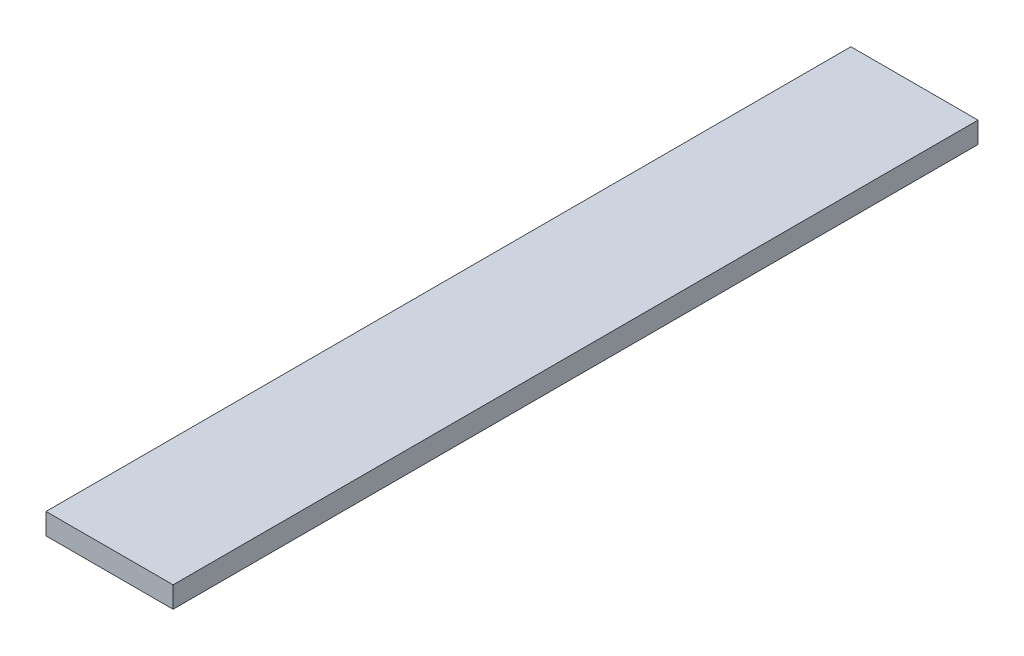
ISO-10303-21;
HEADER;
FILE_DESCRIPTION(('STEP AP214'),'2;1');
FILE_NAME('part.step','',(''),(''),'','','');
FILE_SCHEMA(('AUTOMOTIVE_DESIGN { 1 0 10303 214 1 1 1 1 }'));
ENDSEC;
DATA;
#1=APPLICATION_CONTEXT('core data for automotive mechanical design processes');
#2=APPLICATION_PROTOCOL_DEFINITION('international standard','automotive_design',2000,#1);
#3=PRODUCT_CONTEXT('',#1,'mechanical');
#4=PRODUCT('Part','Part','',(#3));
#5=PRODUCT_RELATED_PRODUCT_CATEGORY('part','',(#4));
#6=PRODUCT_DEFINITION_FORMATION('','',#4);
#7=PRODUCT_DEFINITION_CONTEXT('part definition',#1,'design');
#8=PRODUCT_DEFINITION('design','',#6,#7);
#9=PRODUCT_DEFINITION_SHAPE('','',#8);
#10=(LENGTH_UNIT() NAMED_UNIT(*) SI_UNIT(.MILLI.,.METRE.));
#11=(NAMED_UNIT(*) PLANE_ANGLE_UNIT() SI_UNIT($,.RADIAN.));
#12=(NAMED_UNIT(*) SI_UNIT($,.STERADIAN.) SOLID_ANGLE_UNIT());
#13=UNCERTAINTY_MEASURE_WITH_UNIT(LENGTH_MEASURE(1.E-05),#10,'distance_accuracy_value','');
#14=(GEOMETRIC_REPRESENTATION_CONTEXT(3) GLOBAL_UNCERTAINTY_ASSIGNED_CONTEXT((#13)) GLOBAL_UNIT_ASSIGNED_CONTEXT((#10,
#11,#12)) REPRESENTATION_CONTEXT('',''));
#15=CARTESIAN_POINT('',(0.,0.,0.));
#16=DIRECTION('',(0.,0.,1.));
#17=DIRECTION('',(1.,0.,0.));
#18=AXIS2_PLACEMENT_3D('',#15,#16,#17);
#19=CARTESIAN_POINT('',(19.05,3.175,241.3));
#20=DIRECTION('',(-1.,0.,0.));
#21=DIRECTION('',(0.,0.,1.));
#22=AXIS2_PLACEMENT_3D('',#19,#20,#21);
#23=PLANE('',#22);
#24=DIRECTION('',(0.,1.,0.));
#25=VECTOR('',#24,1.);
#26=CARTESIAN_POINT('',(19.05,3.175,0.));
#27=LINE('',#26,#25);
#28=CARTESIAN_POINT('',(19.05,-3.175,0.));
#29=VERTEX_POINT('',#28);
#30=CARTESIAN_POINT('',(19.05,3.175,0.));
#31=VERTEX_POINT('',#30);
#32=EDGE_CURVE('E100',#29,#31,#27,.T.);
#33=ORIENTED_EDGE('',*,*,#32,.T.);
#34=DIRECTION('',(0.,0.,-1.));
#35=VECTOR('',#34,1.);
#36=CARTESIAN_POINT('',(19.05,3.175,241.3));
#37=LINE('',#36,#35);
#38=CARTESIAN_POINT('',(19.05,3.175,241.3));
#39=VERTEX_POINT('',#38);
#40=EDGE_CURVE('E11',#39,#31,#37,.T.);
#41=ORIENTED_EDGE('',*,*,#40,.F.);
#42=DIRECTION('',(0.,1.,0.));
#43=VECTOR('',#42,1.);
#44=CARTESIAN_POINT('',(19.05,3.175,241.3));
#45=LINE('',#44,#43);
#46=CARTESIAN_POINT('',(19.05,-3.175,241.3));
#47=VERTEX_POINT('',#46);
#48=EDGE_CURVE('E88',#47,#39,#45,.T.);
#49=ORIENTED_EDGE('',*,*,#48,.F.);
#50=DIRECTION('',(0.,0.,-1.));
#51=VECTOR('',#50,1.);
#52=CARTESIAN_POINT('',(19.05,-3.175,241.3));
#53=LINE('',#52,#51);
#54=EDGE_CURVE('E96',#47,#29,#53,.T.);
#55=ORIENTED_EDGE('',*,*,#54,.T.);
#56=EDGE_LOOP('',(#33,#41,#49,#55));
#57=FACE_BOUND('',#56,.T.);
#58=ADVANCED_FACE('F37',(#57),#23,.F.);
#59=CARTESIAN_POINT('',(-19.05,3.175,241.3));
#60=DIRECTION('',(0.,-1.,0.));
#61=DIRECTION('',(0.,0.,-1.));
#62=AXIS2_PLACEMENT_3D('',#59,#60,#61);
#63=PLANE('',#62);
#64=DIRECTION('',(-1.,0.,0.));
#65=VECTOR('',#64,1.);
#66=CARTESIAN_POINT('',(-19.05,3.175,0.));
#67=LINE('',#66,#65);
#68=CARTESIAN_POINT('',(-19.05,3.175,0.));
#69=VERTEX_POINT('',#68);
#70=EDGE_CURVE('E92',#31,#69,#67,.T.);
#71=ORIENTED_EDGE('',*,*,#70,.T.);
#72=DIRECTION('',(0.,0.,-1.));
#73=VECTOR('',#72,1.);
#74=CARTESIAN_POINT('',(-19.05,3.175,241.3));
#75=LINE('',#74,#73);
#76=CARTESIAN_POINT('',(-19.05,3.175,241.3));
#77=VERTEX_POINT('',#76);
#78=EDGE_CURVE('E45',#77,#69,#75,.T.);
#79=ORIENTED_EDGE('',*,*,#78,.F.);
#80=DIRECTION('',(-1.,0.,0.));
#81=VECTOR('',#80,1.);
#82=CARTESIAN_POINT('',(-19.05,3.175,241.3));
#83=LINE('',#82,#81);
#84=EDGE_CURVE('E83',#39,#77,#83,.T.);
#85=ORIENTED_EDGE('',*,*,#84,.F.);
#86=ORIENTED_EDGE('',*,*,#40,.T.);
#87=EDGE_LOOP('',(#71,#79,#85,#86));
#88=FACE_BOUND('',#87,.T.);
#89=ADVANCED_FACE('F91',(#88),#63,.F.);
#90=CARTESIAN_POINT('',(-19.05,3.175,241.3));
#91=DIRECTION('',(1.,0.,0.));
#92=DIRECTION('',(0.,0.,-1.));
#93=AXIS2_PLACEMENT_3D('',#90,#91,#92);
#94=PLANE('',#93);
#95=DIRECTION('',(0.,-1.,0.));
#96=VECTOR('',#95,1.);
#97=CARTESIAN_POINT('',(-19.05,3.175,0.));
#98=LINE('',#97,#96);
#99=CARTESIAN_POINT('',(-19.05,-3.175,0.));
#100=VERTEX_POINT('',#99);
#101=EDGE_CURVE('E70',#69,#100,#98,.T.);
#102=ORIENTED_EDGE('',*,*,#101,.T.);
#103=DIRECTION('',(0.,0.,-1.));
#104=VECTOR('',#103,1.);
#105=CARTESIAN_POINT('',(-19.05,-3.175,241.3));
#106=LINE('',#105,#104);
#107=CARTESIAN_POINT('',(-19.05,-3.175,241.3));
#108=VERTEX_POINT('',#107);
#109=EDGE_CURVE('E93',#108,#100,#106,.T.);
#110=ORIENTED_EDGE('',*,*,#109,.F.);
#111=DIRECTION('',(0.,-1.,0.));
#112=VECTOR('',#111,1.);
#113=CARTESIAN_POINT('',(-19.05,3.175,241.3));
#114=LINE('',#113,#112);
#115=EDGE_CURVE('E86',#77,#108,#114,.T.);
#116=ORIENTED_EDGE('',*,*,#115,.F.);
#117=ORIENTED_EDGE('',*,*,#78,.T.);
#118=EDGE_LOOP('',(#102,#110,#116,#117));
#119=FACE_BOUND('',#118,.T.);
#120=ADVANCED_FACE('F94',(#119),#94,.F.);
#121=CARTESIAN_POINT('',(-19.05,-3.175,241.3));
#122=DIRECTION('',(0.,1.,0.));
#123=DIRECTION('',(0.,0.,1.));
#124=AXIS2_PLACEMENT_3D('',#121,#122,#123);
#125=PLANE('',#124);
#126=DIRECTION('',(1.,0.,0.));
#127=VECTOR('',#126,1.);
#128=CARTESIAN_POINT('',(-19.05,-3.175,0.));
#129=LINE('',#128,#127);
#130=EDGE_CURVE('E76',#100,#29,#129,.T.);
#131=ORIENTED_EDGE('',*,*,#130,.T.);
#132=ORIENTED_EDGE('',*,*,#54,.F.);
#133=DIRECTION('',(1.,0.,0.));
#134=VECTOR('',#133,1.);
#135=CARTESIAN_POINT('',(-19.05,-3.175,241.3));
#136=LINE('',#135,#134);
#137=EDGE_CURVE('E53',#108,#47,#136,.T.);
#138=ORIENTED_EDGE('',*,*,#137,.F.);
#139=ORIENTED_EDGE('',*,*,#109,.T.);
#140=EDGE_LOOP('',(#131,#132,#138,#139));
#141=FACE_BOUND('',#140,.T.);
#142=ADVANCED_FACE('F107',(#141),#125,.F.);
#143=CARTESIAN_POINT('',(0.,0.,241.3));
#144=DIRECTION('',(0.,0.,1.));
#145=DIRECTION('',(1.,0.,0.));
#146=AXIS2_PLACEMENT_3D('',#143,#144,#145);
#147=PLANE('',#146);
#148=ORIENTED_EDGE('',*,*,#48,.T.);
#149=ORIENTED_EDGE('',*,*,#84,.T.);
#150=ORIENTED_EDGE('',*,*,#115,.T.);
#151=ORIENTED_EDGE('',*,*,#137,.T.);
#152=EDGE_LOOP('',(#148,#149,#150,#151));
#153=FACE_BOUND('',#152,.T.);
#154=ADVANCED_FACE('F84',(#153),#147,.T.);
#155=CARTESIAN_POINT('',(0.,0.,0.));
#156=DIRECTION('',(0.,0.,1.));
#157=DIRECTION('',(1.,0.,0.));
#158=AXIS2_PLACEMENT_3D('',#155,#156,#157);
#159=PLANE('',#158);
#160=ORIENTED_EDGE('',*,*,#32,.F.);
#161=ORIENTED_EDGE('',*,*,#130,.F.);
#162=ORIENTED_EDGE('',*,*,#101,.F.);
#163=ORIENTED_EDGE('',*,*,#70,.F.);
#164=EDGE_LOOP('',(#160,#161,#162,#163));
#165=FACE_BOUND('',#164,.T.);
#166=ADVANCED_FACE('F110',(#165),#159,.F.);
#167=CLOSED_SHELL('',(#58,#89,#120,#142,#154,#166));
#168=MANIFOLD_SOLID_BREP('B2',#167);
#169=ADVANCED_BREP_SHAPE_REPRESENTATION('',(#18,#168),#14);
#170=SHAPE_DEFINITION_REPRESENTATION(#9,#169);
ENDSEC;
END-ISO-10303-21;
